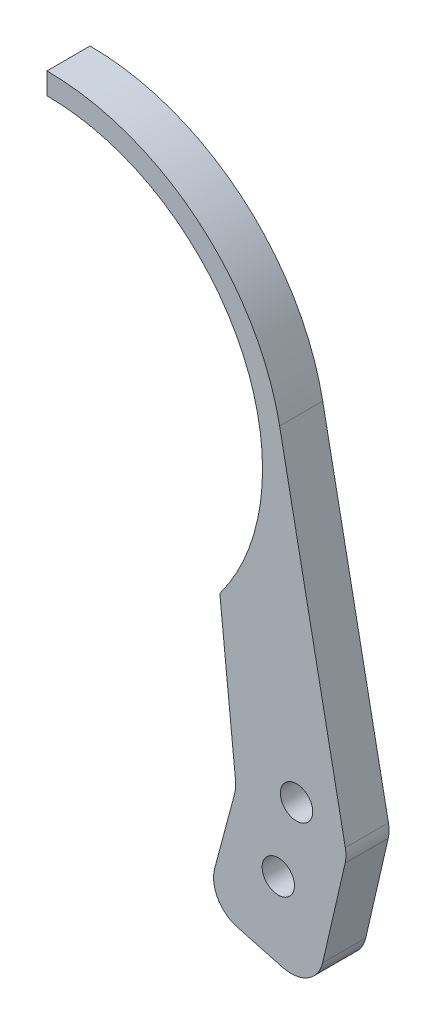
ISO-10303-21;
HEADER;
FILE_DESCRIPTION(('STEP AP214'),'2;1');
FILE_NAME('part.step','',(''),(''),'','','');
FILE_SCHEMA(('AUTOMOTIVE_DESIGN { 1 0 10303 214 1 1 1 1 }'));
ENDSEC;
DATA;
#1=APPLICATION_CONTEXT('core data for automotive mechanical design processes');
#2=APPLICATION_PROTOCOL_DEFINITION('international standard','automotive_design',2000,#1);
#3=PRODUCT_CONTEXT('',#1,'mechanical');
#4=PRODUCT('Part','Part','',(#3));
#5=PRODUCT_RELATED_PRODUCT_CATEGORY('part','',(#4));
#6=PRODUCT_DEFINITION_FORMATION('','',#4);
#7=PRODUCT_DEFINITION_CONTEXT('part definition',#1,'design');
#8=PRODUCT_DEFINITION('design','',#6,#7);
#9=PRODUCT_DEFINITION_SHAPE('','',#8);
#10=(LENGTH_UNIT() NAMED_UNIT(*) SI_UNIT(.MILLI.,.METRE.));
#11=(NAMED_UNIT(*) PLANE_ANGLE_UNIT() SI_UNIT($,.RADIAN.));
#12=(NAMED_UNIT(*) SI_UNIT($,.STERADIAN.) SOLID_ANGLE_UNIT());
#13=UNCERTAINTY_MEASURE_WITH_UNIT(LENGTH_MEASURE(1.E-05),#10,'distance_accuracy_value','');
#14=(GEOMETRIC_REPRESENTATION_CONTEXT(3) GLOBAL_UNCERTAINTY_ASSIGNED_CONTEXT((#13)) GLOBAL_UNIT_ASSIGNED_CONTEXT((#10,
#11,#12)) REPRESENTATION_CONTEXT('',''));
#15=CARTESIAN_POINT('',(0.,0.,0.));
#16=DIRECTION('',(0.,0.,1.));
#17=DIRECTION('',(1.,0.,0.));
#18=AXIS2_PLACEMENT_3D('',#15,#16,#17);
#19=CARTESIAN_POINT('',(22.2888721893436,4.40684909581341,4.));
#20=DIRECTION('',(0.981009345374112,0.193960470943583,0.));
#21=DIRECTION('',(-0.193960470943583,0.981009345374112,0.));
#22=AXIS2_PLACEMENT_3D('',#19,#20,#21);
#23=PLANE('',#22);
#24=DIRECTION('',(0.193960470943583,-0.981009345374112,0.));
#25=VECTOR('',#24,1.);
#26=CARTESIAN_POINT('',(22.2888721893436,4.40684909581341,4.));
#27=LINE('',#26,#25);
#28=CARTESIAN_POINT('',(10.6416017689401,63.3161777591716,4.));
#29=VERTEX_POINT('',#28);
#30=CARTESIAN_POINT('',(16.7377197463868,32.4833556006926,4.));
#31=VERTEX_POINT('',#30);
#32=EDGE_CURVE('E135',#29,#31,#27,.T.);
#33=ORIENTED_EDGE('',*,*,#32,.T.);
#34=DIRECTION('',(0.,0.,-1.));
#35=VECTOR('',#34,1.);
#36=CARTESIAN_POINT('',(16.7377197463868,32.4833556006926,4.));
#37=LINE('',#36,#35);
#38=CARTESIAN_POINT('',(16.7377197463868,32.4833556006926,0.));
#39=VERTEX_POINT('',#38);
#40=EDGE_CURVE('E234',#31,#39,#37,.T.);
#41=ORIENTED_EDGE('',*,*,#40,.T.);
#42=DIRECTION('',(0.193960470943583,-0.981009345374112,0.));
#43=VECTOR('',#42,1.);
#44=CARTESIAN_POINT('',(22.2888721893436,4.40684909581341,0.));
#45=LINE('',#44,#43);
#46=CARTESIAN_POINT('',(10.6416017689401,63.3161777591716,0.));
#47=VERTEX_POINT('',#46);
#48=EDGE_CURVE('E138',#47,#39,#45,.T.);
#49=ORIENTED_EDGE('',*,*,#48,.F.);
#50=DIRECTION('',(0.,0.,-1.));
#51=VECTOR('',#50,1.);
#52=CARTESIAN_POINT('',(10.6416017689401,63.3161777591716,4.));
#53=LINE('',#52,#51);
#54=EDGE_CURVE('E131',#29,#47,#53,.T.);
#55=ORIENTED_EDGE('',*,*,#54,.F.);
#56=EDGE_LOOP('',(#33,#41,#49,#55));
#57=FACE_BOUND('',#56,.T.);
#58=ADVANCED_FACE('F41',(#57),#23,.T.);
#59=CARTESIAN_POINT('',(-10.9406038292904,59.0490473984128,4.));
#60=DIRECTION('',(0.,0.,-1.));
#61=DIRECTION('',(-1.,0.,0.));
#62=AXIS2_PLACEMENT_3D('',#59,#60,#61);
#63=CYLINDRICAL_SURFACE('',#62,22.);
#64=CARTESIAN_POINT('',(-10.9406038292904,59.0490473984128,0.));
#65=DIRECTION('',(0.,0.,1.));
#66=DIRECTION('',(1.,0.,0.));
#67=AXIS2_PLACEMENT_3D('',#64,#65,#66);
#68=CIRCLE('',#67,22.);
#69=CARTESIAN_POINT('',(-10.9406038292904,81.0490473984128,0.));
#70=VERTEX_POINT('',#69);
#71=EDGE_CURVE('E185',#47,#70,#68,.T.);
#72=ORIENTED_EDGE('',*,*,#71,.T.);
#73=DIRECTION('',(0.,0.,-1.));
#74=VECTOR('',#73,1.);
#75=CARTESIAN_POINT('',(-10.9406038292904,81.0490473984128,4.));
#76=LINE('',#75,#74);
#77=CARTESIAN_POINT('',(-10.9406038292904,81.0490473984128,4.));
#78=VERTEX_POINT('',#77);
#79=EDGE_CURVE('E143',#78,#70,#76,.T.);
#80=ORIENTED_EDGE('',*,*,#79,.F.);
#81=CARTESIAN_POINT('',(-10.9406038292904,59.0490473984128,4.));
#82=DIRECTION('',(0.,0.,1.));
#83=DIRECTION('',(1.,0.,0.));
#84=AXIS2_PLACEMENT_3D('',#81,#82,#83);
#85=CIRCLE('',#84,22.);
#86=EDGE_CURVE('E146',#29,#78,#85,.T.);
#87=ORIENTED_EDGE('',*,*,#86,.F.);
#88=ORIENTED_EDGE('',*,*,#54,.T.);
#89=EDGE_LOOP('',(#72,#80,#87,#88));
#90=FACE_BOUND('',#89,.T.);
#91=ADVANCED_FACE('F147',(#90),#63,.T.);
#92=CARTESIAN_POINT('',(-10.9406038292903,0.,4.));
#93=DIRECTION('',(-1.,0.,0.));
#94=DIRECTION('',(0.,-1.,0.));
#95=AXIS2_PLACEMENT_3D('',#92,#93,#94);
#96=PLANE('',#95);
#97=DIRECTION('',(0.,1.,0.));
#98=VECTOR('',#97,1.);
#99=CARTESIAN_POINT('',(-10.9406038292903,0.,0.));
#100=LINE('',#99,#98);
#101=CARTESIAN_POINT('',(-10.9406038292904,79.0490473984128,0.));
#102=VERTEX_POINT('',#101);
#103=EDGE_CURVE('E187',#102,#70,#100,.T.);
#104=ORIENTED_EDGE('',*,*,#103,.F.);
#105=DIRECTION('',(0.,0.,-1.));
#106=VECTOR('',#105,1.);
#107=CARTESIAN_POINT('',(-10.9406038292904,79.0490473984128,4.));
#108=LINE('',#107,#106);
#109=CARTESIAN_POINT('',(-10.9406038292904,79.0490473984128,4.));
#110=VERTEX_POINT('',#109);
#111=EDGE_CURVE('E206',#110,#102,#108,.T.);
#112=ORIENTED_EDGE('',*,*,#111,.F.);
#113=DIRECTION('',(0.,1.,0.));
#114=VECTOR('',#113,1.);
#115=CARTESIAN_POINT('',(-10.9406038292903,0.,4.));
#116=LINE('',#115,#114);
#117=EDGE_CURVE('E150',#110,#78,#116,.T.);
#118=ORIENTED_EDGE('',*,*,#117,.T.);
#119=ORIENTED_EDGE('',*,*,#79,.T.);
#120=EDGE_LOOP('',(#104,#112,#118,#119));
#121=FACE_BOUND('',#120,.T.);
#122=ADVANCED_FACE('F275',(#121),#96,.T.);
#123=CARTESIAN_POINT('',(-10.9406038292904,59.0490473984128,4.));
#124=DIRECTION('',(0.,0.,-1.));
#125=DIRECTION('',(-1.,0.,0.));
#126=AXIS2_PLACEMENT_3D('',#123,#124,#125);
#127=CYLINDRICAL_SURFACE('',#126,20.);
#128=CARTESIAN_POINT('',(-10.9406038292904,59.0490473984128,0.));
#129=DIRECTION('',(0.,0.,1.));
#130=DIRECTION('',(1.,0.,0.));
#131=AXIS2_PLACEMENT_3D('',#128,#129,#130);
#132=CIRCLE('',#131,20.);
#133=CARTESIAN_POINT('',(5.09570359765884,47.0976104928197,0.));
#134=VERTEX_POINT('',#133);
#135=EDGE_CURVE('E190',#134,#102,#132,.T.);
#136=ORIENTED_EDGE('',*,*,#135,.F.);
#137=DIRECTION('',(0.,0.,-1.));
#138=VECTOR('',#137,1.);
#139=CARTESIAN_POINT('',(5.09570359765884,47.0976104928197,4.));
#140=LINE('',#139,#138);
#141=CARTESIAN_POINT('',(5.09570359765884,47.0976104928197,4.));
#142=VERTEX_POINT('',#141);
#143=EDGE_CURVE('E177',#142,#134,#140,.T.);
#144=ORIENTED_EDGE('',*,*,#143,.F.);
#145=CARTESIAN_POINT('',(-10.9406038292904,59.0490473984128,4.));
#146=DIRECTION('',(0.,0.,1.));
#147=DIRECTION('',(1.,0.,0.));
#148=AXIS2_PLACEMENT_3D('',#145,#146,#147);
#149=CIRCLE('',#148,20.);
#150=EDGE_CURVE('E164',#142,#110,#149,.T.);
#151=ORIENTED_EDGE('',*,*,#150,.T.);
#152=ORIENTED_EDGE('',*,*,#111,.T.);
#153=EDGE_LOOP('',(#136,#144,#151,#152));
#154=FACE_BOUND('',#153,.T.);
#155=ADVANCED_FACE('F378',(#154),#127,.F.);
#156=CARTESIAN_POINT('',(9.79251884533772,0.997694925466114,4.));
#157=DIRECTION('',(-0.994849947884101,-0.101358675973012,0.));
#158=DIRECTION('',(0.101358675973012,-0.994849947884101,0.));
#159=AXIS2_PLACEMENT_3D('',#156,#157,#158);
#160=PLANE('',#159);
#161=DIRECTION('',(-0.101358675973012,0.994849947884101,0.));
#162=VECTOR('',#161,1.);
#163=CARTESIAN_POINT('',(9.79251884533772,0.997694925466114,0.));
#164=LINE('',#163,#162);
#165=CARTESIAN_POINT('',(6.55661073545678,32.7585973205404,0.));
#166=VERTEX_POINT('',#165);
#167=EDGE_CURVE('E193',#166,#134,#164,.T.);
#168=ORIENTED_EDGE('',*,*,#167,.F.);
#169=DIRECTION('',(0.,0.,-1.));
#170=VECTOR('',#169,1.);
#171=CARTESIAN_POINT('',(6.55661073545678,32.7585973205404,4.));
#172=LINE('',#171,#170);
#173=CARTESIAN_POINT('',(6.55661073545678,32.7585973205404,4.));
#174=VERTEX_POINT('',#173);
#175=EDGE_CURVE('E213',#166,#174,#172,.F.);
#176=ORIENTED_EDGE('',*,*,#175,.T.);
#177=DIRECTION('',(-0.101358675973012,0.994849947884101,0.));
#178=VECTOR('',#177,1.);
#179=CARTESIAN_POINT('',(9.79251884533772,0.997694925466114,4.));
#180=LINE('',#179,#178);
#181=EDGE_CURVE('E167',#174,#142,#180,.T.);
#182=ORIENTED_EDGE('',*,*,#181,.T.);
#183=ORIENTED_EDGE('',*,*,#143,.T.);
#184=EDGE_LOOP('',(#168,#176,#182,#183));
#185=FACE_BOUND('',#184,.T.);
#186=ADVANCED_FACE('F243',(#185),#160,.T.);
#187=CARTESIAN_POINT('',(-1.88252287689253,0.504384183671969,4.));
#188=DIRECTION('',(-0.965930482672366,0.258801666618145,0.));
#189=DIRECTION('',(-0.258801666618145,-0.965930482672366,0.));
#190=AXIS2_PLACEMENT_3D('',#187,#188,#189);
#191=PLANE('',#190);
#192=DIRECTION('',(0.258801666618145,0.965930482672366,0.));
#193=VECTOR('',#192,1.);
#194=CARTESIAN_POINT('',(-1.88252287689253,0.504384183671969,4.));
#195=LINE('',#194,#193);
#196=CARTESIAN_POINT('',(4.61536155603004,24.7565643518274,4.));
#197=VERTEX_POINT('',#196);
#198=CARTESIAN_POINT('',(6.46985233982158,31.678116292767,4.));
#199=VERTEX_POINT('',#198);
#200=EDGE_CURVE('E169',#197,#199,#195,.T.);
#201=ORIENTED_EDGE('',*,*,#200,.T.);
#202=DIRECTION('',(0.,0.,-1.));
#203=VECTOR('',#202,1.);
#204=CARTESIAN_POINT('',(6.46985233982158,31.678116292767,0.));
#205=LINE('',#204,#203);
#206=CARTESIAN_POINT('',(6.46985233982158,31.678116292767,0.));
#207=VERTEX_POINT('',#206);
#208=EDGE_CURVE('E210',#199,#207,#205,.T.);
#209=ORIENTED_EDGE('',*,*,#208,.T.);
#210=DIRECTION('',(0.258801666618145,0.965930482672366,0.));
#211=VECTOR('',#210,1.);
#212=CARTESIAN_POINT('',(-1.88252287689253,0.504384183671969,0.));
#213=LINE('',#212,#211);
#214=CARTESIAN_POINT('',(4.61536155603004,24.7565643518274,0.));
#215=VERTEX_POINT('',#214);
#216=EDGE_CURVE('E195',#215,#207,#213,.T.);
#217=ORIENTED_EDGE('',*,*,#216,.F.);
#218=DIRECTION('',(0.,0.,-1.));
#219=VECTOR('',#218,1.);
#220=CARTESIAN_POINT('',(4.61536155603004,24.7565643518274,4.));
#221=LINE('',#220,#219);
#222=EDGE_CURVE('E142',#215,#197,#221,.F.);
#223=ORIENTED_EDGE('',*,*,#222,.T.);
#224=EDGE_LOOP('',(#201,#209,#217,#223));
#225=FACE_BOUND('',#224,.T.);
#226=ADVANCED_FACE('F252',(#225),#191,.T.);
#227=CARTESIAN_POINT('',(5.72147943306814,21.3543887201383,4.));
#228=DIRECTION('',(-0.258801666618145,-0.965930482672366,0.));
#229=DIRECTION('',(0.965930482672366,-0.258801666618145,0.));
#230=AXIS2_PLACEMENT_3D('',#227,#228,#229);
#231=PLANE('',#230);
#232=DIRECTION('',(-0.965930482672366,0.258801666618145,0.));
#233=VECTOR('',#232,1.);
#234=CARTESIAN_POINT('',(5.72147943306814,21.3543887201383,4.));
#235=LINE('',#234,#233);
#236=CARTESIAN_POINT('',(10.9338679054315,19.9578339494713,4.));
#237=VERTEX_POINT('',#236);
#238=CARTESIAN_POINT('',(6.7367480041927,21.0823679039559,4.));
#239=VERTEX_POINT('',#238);
#240=EDGE_CURVE('E172',#237,#239,#235,.T.);
#241=ORIENTED_EDGE('',*,*,#240,.T.);
#242=DIRECTION('',(0.,0.,-1.));
#243=VECTOR('',#242,1.);
#244=CARTESIAN_POINT('',(6.7367480041927,21.0823679039559,4.));
#245=LINE('',#244,#243);
#246=CARTESIAN_POINT('',(6.7367480041927,21.0823679039559,0.));
#247=VERTEX_POINT('',#246);
#248=EDGE_CURVE('E217',#239,#247,#245,.T.);
#249=ORIENTED_EDGE('',*,*,#248,.T.);
#250=DIRECTION('',(-0.965930482672366,0.258801666618145,0.));
#251=VECTOR('',#250,1.);
#252=CARTESIAN_POINT('',(5.72147943306814,21.3543887201383,0.));
#253=LINE('',#252,#251);
#254=CARTESIAN_POINT('',(10.9338679054315,19.9578339494713,0.));
#255=VERTEX_POINT('',#254);
#256=EDGE_CURVE('E198',#255,#247,#253,.T.);
#257=ORIENTED_EDGE('',*,*,#256,.F.);
#258=DIRECTION('',(0.,0.,-1.));
#259=VECTOR('',#258,1.);
#260=CARTESIAN_POINT('',(10.9338679054315,19.9578339494713,4.));
#261=LINE('',#260,#259);
#262=EDGE_CURVE('E215',#255,#237,#261,.F.);
#263=ORIENTED_EDGE('',*,*,#262,.T.);
#264=EDGE_LOOP('',(#241,#249,#257,#263));
#265=FACE_BOUND('',#264,.T.);
#266=ADVANCED_FACE('F258',(#265),#231,.T.);
#267=CARTESIAN_POINT('',(10.5202636249246,27.0671957151586,4.));
#268=DIRECTION('',(0.,0.,-1.));
#269=DIRECTION('',(-1.,0.,0.));
#270=AXIS2_PLACEMENT_3D('',#267,#268,#269);
#271=CYLINDRICAL_SURFACE('',#270,1.49999999999908);
#272=CARTESIAN_POINT('',(10.5202636249246,27.0671957151586,4.));
#273=DIRECTION('',(0.,0.,1.));
#274=DIRECTION('',(1.,0.,0.));
#275=AXIS2_PLACEMENT_3D('',#272,#273,#274);
#276=CIRCLE('',#275,1.49999999999908);
#277=CARTESIAN_POINT('',(12.0202636249237,27.0671957151586,4.));
#278=VERTEX_POINT('',#277);
#279=EDGE_CURVE('E156',#278,#278,#276,.T.);
#280=ORIENTED_EDGE('',*,*,#279,.T.);
#281=EDGE_LOOP('',(#280));
#282=FACE_BOUND('',#281,.T.);
#283=CARTESIAN_POINT('',(10.5202636249246,27.0671957151586,0.));
#284=DIRECTION('',(0.,0.,1.));
#285=DIRECTION('',(1.,0.,0.));
#286=AXIS2_PLACEMENT_3D('',#283,#284,#285);
#287=CIRCLE('',#286,1.49999999999908);
#288=CARTESIAN_POINT('',(12.0202636249237,27.0671957151586,0.));
#289=VERTEX_POINT('',#288);
#290=EDGE_CURVE('E181',#289,#289,#287,.T.);
#291=ORIENTED_EDGE('',*,*,#290,.F.);
#292=EDGE_LOOP('',(#291));
#293=FACE_BOUND('',#292,.T.);
#294=ADVANCED_FACE('F279',(#282,#293),#271,.F.);
#295=CARTESIAN_POINT('',(12.2124452483104,33.8595827295649,4.));
#296=DIRECTION('',(0.,0.,-1.));
#297=DIRECTION('',(-1.,0.,0.));
#298=AXIS2_PLACEMENT_3D('',#295,#296,#297);
#299=CYLINDRICAL_SURFACE('',#298,1.49999999999908);
#300=CARTESIAN_POINT('',(12.2124452483104,33.8595827295649,4.));
#301=DIRECTION('',(0.,0.,1.));
#302=DIRECTION('',(1.,0.,0.));
#303=AXIS2_PLACEMENT_3D('',#300,#301,#302);
#304=CIRCLE('',#303,1.49999999999908);
#305=CARTESIAN_POINT('',(13.7124452483095,33.8595827295649,4.));
#306=VERTEX_POINT('',#305);
#307=EDGE_CURVE('E159',#306,#306,#304,.T.);
#308=ORIENTED_EDGE('',*,*,#307,.T.);
#309=EDGE_LOOP('',(#308));
#310=FACE_BOUND('',#309,.T.);
#311=CARTESIAN_POINT('',(12.2124452483104,33.8595827295649,0.));
#312=DIRECTION('',(0.,0.,1.));
#313=DIRECTION('',(1.,0.,0.));
#314=AXIS2_PLACEMENT_3D('',#311,#312,#313);
#315=CIRCLE('',#314,1.49999999999908);
#316=CARTESIAN_POINT('',(13.7124452483095,33.8595827295649,0.));
#317=VERTEX_POINT('',#316);
#318=EDGE_CURVE('E178',#317,#317,#315,.T.);
#319=ORIENTED_EDGE('',*,*,#318,.F.);
#320=EDGE_LOOP('',(#319));
#321=FACE_BOUND('',#320,.T.);
#322=ADVANCED_FACE('F282',(#310,#321),#299,.F.);
#323=CARTESIAN_POINT('',(9.04219279312698,-2.08357636005287,4.));
#324=DIRECTION('',(0.974463953222844,-0.22454399094455,0.));
#325=DIRECTION('',(0.22454399094455,0.974463953222844,0.));
#326=AXIS2_PLACEMENT_3D('',#323,#324,#325);
#327=PLANE('',#326);
#328=DIRECTION('',(-0.22454399094455,-0.974463953222844,0.));
#329=VECTOR('',#328,1.);
#330=CARTESIAN_POINT('',(9.04219279312698,-2.08357636005287,4.));
#331=LINE('',#330,#329);
#332=CARTESIAN_POINT('',(16.718083569933,31.2278422150282,4.));
#333=VERTEX_POINT('',#332);
#334=CARTESIAN_POINT('',(14.6336647649545,22.1819934246547,4.));
#335=VERTEX_POINT('',#334);
#336=EDGE_CURVE('E175',#333,#335,#331,.T.);
#337=ORIENTED_EDGE('',*,*,#336,.T.);
#338=DIRECTION('',(0.,0.,-1.));
#339=VECTOR('',#338,1.);
#340=CARTESIAN_POINT('',(14.6336647649545,22.1819934246547,4.));
#341=LINE('',#340,#339);
#342=CARTESIAN_POINT('',(14.6336647649545,22.1819934246547,0.));
#343=VERTEX_POINT('',#342);
#344=EDGE_CURVE('E231',#335,#343,#341,.T.);
#345=ORIENTED_EDGE('',*,*,#344,.T.);
#346=DIRECTION('',(-0.22454399094455,-0.974463953222844,0.));
#347=VECTOR('',#346,1.);
#348=CARTESIAN_POINT('',(9.04219279312698,-2.08357636005287,0.));
#349=LINE('',#348,#347);
#350=CARTESIAN_POINT('',(16.718083569933,31.2278422150282,0.));
#351=VERTEX_POINT('',#350);
#352=EDGE_CURVE('E201',#351,#343,#349,.T.);
#353=ORIENTED_EDGE('',*,*,#352,.F.);
#354=DIRECTION('',(0.,0.,-1.));
#355=VECTOR('',#354,1.);
#356=CARTESIAN_POINT('',(16.718083569933,31.2278422150282,4.));
#357=LINE('',#356,#355);
#358=EDGE_CURVE('E63',#351,#333,#357,.F.);
#359=ORIENTED_EDGE('',*,*,#358,.T.);
#360=EDGE_LOOP('',(#337,#345,#353,#359));
#361=FACE_BOUND('',#360,.T.);
#362=ADVANCED_FACE('F264',(#361),#327,.T.);
#363=CARTESIAN_POINT('',(0.,0.,4.));
#364=DIRECTION('',(0.,0.,1.));
#365=DIRECTION('',(1.,0.,0.));
#366=AXIS2_PLACEMENT_3D('',#363,#364,#365);
#367=PLANE('',#366);
#368=ORIENTED_EDGE('',*,*,#307,.F.);
#369=EDGE_LOOP('',(#368));
#370=FACE_BOUND('',#369,.T.);
#371=ORIENTED_EDGE('',*,*,#279,.F.);
#372=EDGE_LOOP('',(#371));
#373=FACE_BOUND('',#372,.T.);
#374=ORIENTED_EDGE('',*,*,#200,.F.);
#375=CARTESIAN_POINT('',(7.51315300404714,23.980159351973,4.));
#376=DIRECTION('',(0.,0.,1.));
#377=DIRECTION('',(1.,0.,0.));
#378=AXIS2_PLACEMENT_3D('',#375,#376,#377);
#379=CIRCLE('',#378,3.);
#380=EDGE_CURVE('E228',#197,#239,#379,.T.);
#381=ORIENTED_EDGE('',*,*,#380,.T.);
#382=ORIENTED_EDGE('',*,*,#240,.F.);
#383=CARTESIAN_POINT('',(11.7102729052859,22.8556253974884,4.));
#384=DIRECTION('',(0.,0.,1.));
#385=DIRECTION('',(1.,0.,0.));
#386=AXIS2_PLACEMENT_3D('',#383,#384,#385);
#387=CIRCLE('',#386,3.);
#388=EDGE_CURVE('E56',#237,#335,#387,.T.);
#389=ORIENTED_EDGE('',*,*,#388,.T.);
#390=ORIENTED_EDGE('',*,*,#336,.F.);
#391=CARTESIAN_POINT('',(13.7946917102644,31.9014741878619,4.));
#392=DIRECTION('',(0.,0.,1.));
#393=DIRECTION('',(1.,0.,0.));
#394=AXIS2_PLACEMENT_3D('',#391,#392,#393);
#395=CIRCLE('',#394,3.);
#396=EDGE_CURVE('E155',#333,#31,#395,.T.);
#397=ORIENTED_EDGE('',*,*,#396,.T.);
#398=ORIENTED_EDGE('',*,*,#32,.F.);
#399=ORIENTED_EDGE('',*,*,#86,.T.);
#400=ORIENTED_EDGE('',*,*,#117,.F.);
#401=ORIENTED_EDGE('',*,*,#150,.F.);
#402=ORIENTED_EDGE('',*,*,#181,.F.);
#403=CARTESIAN_POINT('',(3.57206089180448,32.4545212926214,4.));
#404=DIRECTION('',(0.,0.,1.));
#405=DIRECTION('',(1.,0.,0.));
#406=AXIS2_PLACEMENT_3D('',#403,#404,#405);
#407=CIRCLE('',#406,3.);
#408=EDGE_CURVE('E11',#174,#199,#407,.F.);
#409=ORIENTED_EDGE('',*,*,#408,.T.);
#410=EDGE_LOOP('',(#374,#381,#382,#389,#390,#397,#398,#399,#400,#401,#402,#409));
#411=FACE_BOUND('',#410,.T.);
#412=ADVANCED_FACE('F153',(#370,#373,#411),#367,.T.);
#413=CARTESIAN_POINT('',(0.,0.,0.));
#414=DIRECTION('',(0.,0.,1.));
#415=DIRECTION('',(1.,0.,0.));
#416=AXIS2_PLACEMENT_3D('',#413,#414,#415);
#417=PLANE('',#416);
#418=ORIENTED_EDGE('',*,*,#318,.T.);
#419=EDGE_LOOP('',(#418));
#420=FACE_BOUND('',#419,.T.);
#421=ORIENTED_EDGE('',*,*,#290,.T.);
#422=EDGE_LOOP('',(#421));
#423=FACE_BOUND('',#422,.T.);
#424=ORIENTED_EDGE('',*,*,#256,.T.);
#425=CARTESIAN_POINT('',(7.51315300404714,23.980159351973,0.));
#426=DIRECTION('',(0.,0.,1.));
#427=DIRECTION('',(1.,0.,0.));
#428=AXIS2_PLACEMENT_3D('',#425,#426,#427);
#429=CIRCLE('',#428,3.);
#430=EDGE_CURVE('E224',#247,#215,#429,.F.);
#431=ORIENTED_EDGE('',*,*,#430,.T.);
#432=ORIENTED_EDGE('',*,*,#216,.T.);
#433=CARTESIAN_POINT('',(3.57206089180448,32.4545212926214,0.));
#434=DIRECTION('',(0.,0.,1.));
#435=DIRECTION('',(1.,0.,0.));
#436=AXIS2_PLACEMENT_3D('',#433,#434,#435);
#437=CIRCLE('',#436,3.);
#438=EDGE_CURVE('E49',#207,#166,#437,.T.);
#439=ORIENTED_EDGE('',*,*,#438,.T.);
#440=ORIENTED_EDGE('',*,*,#167,.T.);
#441=ORIENTED_EDGE('',*,*,#135,.T.);
#442=ORIENTED_EDGE('',*,*,#103,.T.);
#443=ORIENTED_EDGE('',*,*,#71,.F.);
#444=ORIENTED_EDGE('',*,*,#48,.T.);
#445=CARTESIAN_POINT('',(13.7946917102644,31.9014741878619,0.));
#446=DIRECTION('',(0.,0.,1.));
#447=DIRECTION('',(1.,0.,0.));
#448=AXIS2_PLACEMENT_3D('',#445,#446,#447);
#449=CIRCLE('',#448,3.);
#450=EDGE_CURVE('E220',#39,#351,#449,.F.);
#451=ORIENTED_EDGE('',*,*,#450,.T.);
#452=ORIENTED_EDGE('',*,*,#352,.T.);
#453=CARTESIAN_POINT('',(11.7102729052859,22.8556253974884,0.));
#454=DIRECTION('',(0.,0.,1.));
#455=DIRECTION('',(1.,0.,0.));
#456=AXIS2_PLACEMENT_3D('',#453,#454,#455);
#457=CIRCLE('',#456,3.);
#458=EDGE_CURVE('E222',#343,#255,#457,.F.);
#459=ORIENTED_EDGE('',*,*,#458,.T.);
#460=EDGE_LOOP('',(#424,#431,#432,#439,#440,#441,#442,#443,#444,#451,#452,#459));
#461=FACE_BOUND('',#460,.T.);
#462=ADVANCED_FACE('F237',(#420,#423,#461),#417,.F.);
#463=CARTESIAN_POINT('',(3.57206089180448,32.4545212926214,4.));
#464=DIRECTION('',(0.,0.,1.));
#465=DIRECTION('',(1.,0.,0.));
#466=AXIS2_PLACEMENT_3D('',#463,#464,#465);
#467=CYLINDRICAL_SURFACE('',#466,3.);
#468=ORIENTED_EDGE('',*,*,#408,.F.);
#469=ORIENTED_EDGE('',*,*,#175,.F.);
#470=ORIENTED_EDGE('',*,*,#438,.F.);
#471=ORIENTED_EDGE('',*,*,#208,.F.);
#472=EDGE_LOOP('',(#468,#469,#470,#471));
#473=FACE_BOUND('',#472,.T.);
#474=ADVANCED_FACE('F248',(#473),#467,.F.);
#475=CARTESIAN_POINT('',(7.51315300404714,23.980159351973,4.));
#476=DIRECTION('',(0.,0.,-1.));
#477=DIRECTION('',(-1.,0.,0.));
#478=AXIS2_PLACEMENT_3D('',#475,#476,#477);
#479=CYLINDRICAL_SURFACE('',#478,3.);
#480=ORIENTED_EDGE('',*,*,#380,.F.);
#481=ORIENTED_EDGE('',*,*,#222,.F.);
#482=ORIENTED_EDGE('',*,*,#430,.F.);
#483=ORIENTED_EDGE('',*,*,#248,.F.);
#484=EDGE_LOOP('',(#480,#481,#482,#483));
#485=FACE_BOUND('',#484,.T.);
#486=ADVANCED_FACE('F255',(#485),#479,.T.);
#487=CARTESIAN_POINT('',(11.7102729052859,22.8556253974884,4.));
#488=DIRECTION('',(0.,0.,-1.));
#489=DIRECTION('',(-1.,0.,0.));
#490=AXIS2_PLACEMENT_3D('',#487,#488,#489);
#491=CYLINDRICAL_SURFACE('',#490,3.);
#492=ORIENTED_EDGE('',*,*,#388,.F.);
#493=ORIENTED_EDGE('',*,*,#262,.F.);
#494=ORIENTED_EDGE('',*,*,#458,.F.);
#495=ORIENTED_EDGE('',*,*,#344,.F.);
#496=EDGE_LOOP('',(#492,#493,#494,#495));
#497=FACE_BOUND('',#496,.T.);
#498=ADVANCED_FACE('F262',(#497),#491,.T.);
#499=CARTESIAN_POINT('',(13.7946917102644,31.9014741878619,4.));
#500=DIRECTION('',(0.,0.,-1.));
#501=DIRECTION('',(-1.,0.,0.));
#502=AXIS2_PLACEMENT_3D('',#499,#500,#501);
#503=CYLINDRICAL_SURFACE('',#502,3.);
#504=ORIENTED_EDGE('',*,*,#396,.F.);
#505=ORIENTED_EDGE('',*,*,#358,.F.);
#506=ORIENTED_EDGE('',*,*,#450,.F.);
#507=ORIENTED_EDGE('',*,*,#40,.F.);
#508=EDGE_LOOP('',(#504,#505,#506,#507));
#509=FACE_BOUND('',#508,.T.);
#510=ADVANCED_FACE('F43',(#509),#503,.T.);
#511=CLOSED_SHELL('',(#58,#91,#122,#155,#186,#226,#266,#294,#322,#362,#412,#462,#474,#486,#498,#510));
#512=MANIFOLD_SOLID_BREP('B2',#511);
#513=ADVANCED_BREP_SHAPE_REPRESENTATION('',(#18,#512),#14);
#514=SHAPE_DEFINITION_REPRESENTATION(#9,#513);
ENDSEC;
END-ISO-10303-21;
